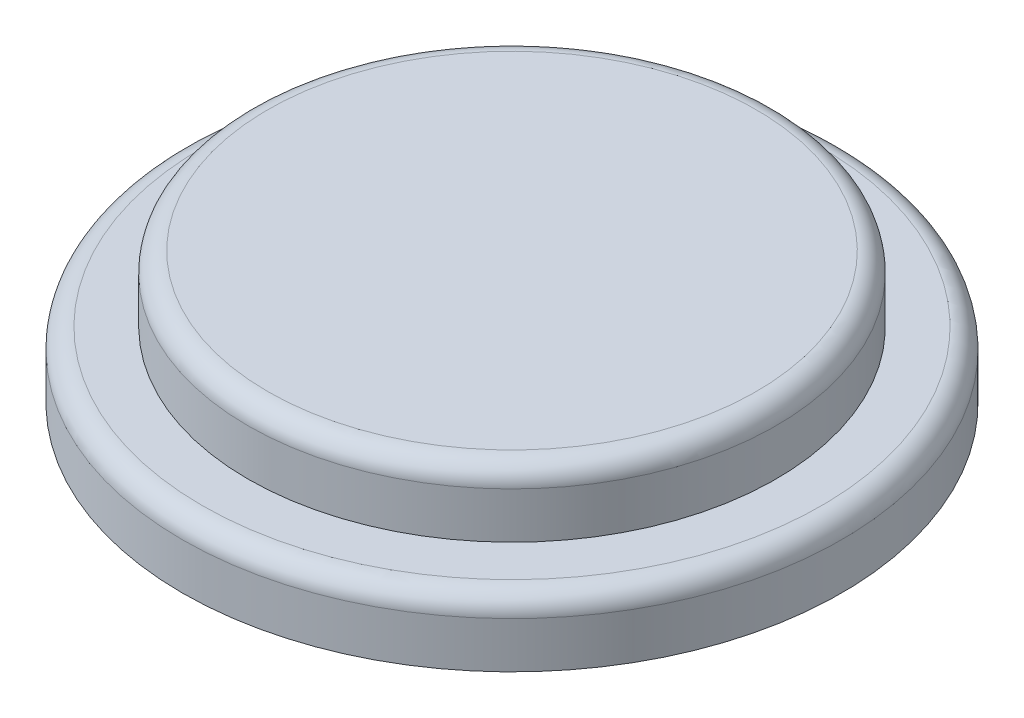
ISO-10303-21;
HEADER;
FILE_DESCRIPTION(('STEP AP214'),'2;1');
FILE_NAME('part.step','',(''),(''),'','','');
FILE_SCHEMA(('AUTOMOTIVE_DESIGN { 1 0 10303 214 1 1 1 1 }'));
ENDSEC;
DATA;
#1=APPLICATION_CONTEXT('core data for automotive mechanical design processes');
#2=APPLICATION_PROTOCOL_DEFINITION('international standard','automotive_design',2000,#1);
#3=PRODUCT_CONTEXT('',#1,'mechanical');
#4=PRODUCT('Part','Part','',(#3));
#5=PRODUCT_RELATED_PRODUCT_CATEGORY('part','',(#4));
#6=PRODUCT_DEFINITION_FORMATION('','',#4);
#7=PRODUCT_DEFINITION_CONTEXT('part definition',#1,'design');
#8=PRODUCT_DEFINITION('design','',#6,#7);
#9=PRODUCT_DEFINITION_SHAPE('','',#8);
#10=(LENGTH_UNIT() NAMED_UNIT(*) SI_UNIT(.MILLI.,.METRE.));
#11=(NAMED_UNIT(*) PLANE_ANGLE_UNIT() SI_UNIT($,.RADIAN.));
#12=(NAMED_UNIT(*) SI_UNIT($,.STERADIAN.) SOLID_ANGLE_UNIT());
#13=UNCERTAINTY_MEASURE_WITH_UNIT(LENGTH_MEASURE(1.E-05),#10,'distance_accuracy_value','');
#14=(GEOMETRIC_REPRESENTATION_CONTEXT(3) GLOBAL_UNCERTAINTY_ASSIGNED_CONTEXT((#13)) GLOBAL_UNIT_ASSIGNED_CONTEXT((#10,
#11,#12)) REPRESENTATION_CONTEXT('',''));
#15=CARTESIAN_POINT('',(0.,0.,0.));
#16=DIRECTION('',(0.,0.,1.));
#17=DIRECTION('',(1.,0.,0.));
#18=AXIS2_PLACEMENT_3D('',#15,#16,#17);
#19=CARTESIAN_POINT('',(0.,2.54,0.));
#20=DIRECTION('',(0.,-1.,0.));
#21=DIRECTION('',(0.,0.,-1.));
#22=AXIS2_PLACEMENT_3D('',#19,#20,#21);
#23=CYLINDRICAL_SURFACE('',#22,12.7);
#24=CARTESIAN_POINT('',(0.,1.778,0.));
#25=DIRECTION('',(0.,1.,0.));
#26=DIRECTION('',(0.,0.,1.));
#27=AXIS2_PLACEMENT_3D('',#24,#25,#26);
#28=CIRCLE('',#27,12.7);
#29=CARTESIAN_POINT('',(0.,1.778,12.7));
#30=VERTEX_POINT('',#29);
#31=EDGE_CURVE('E50',#30,#30,#28,.F.);
#32=ORIENTED_EDGE('',*,*,#31,.T.);
#33=EDGE_LOOP('',(#32));
#34=FACE_BOUND('',#33,.T.);
#35=CARTESIAN_POINT('',(0.,0.,0.));
#36=DIRECTION('',(0.,1.,0.));
#37=DIRECTION('',(0.,0.,1.));
#38=AXIS2_PLACEMENT_3D('',#35,#36,#37);
#39=CIRCLE('',#38,12.7);
#40=CARTESIAN_POINT('',(0.,0.,12.7));
#41=VERTEX_POINT('',#40);
#42=EDGE_CURVE('E62',#41,#41,#39,.T.);
#43=ORIENTED_EDGE('',*,*,#42,.T.);
#44=EDGE_LOOP('',(#43));
#45=FACE_BOUND('',#44,.T.);
#46=ADVANCED_FACE('F37',(#34,#45),#23,.T.);
#47=CARTESIAN_POINT('',(0.,2.54,0.));
#48=DIRECTION('',(0.,1.,0.));
#49=DIRECTION('',(0.,0.,1.));
#50=AXIS2_PLACEMENT_3D('',#47,#48,#49);
#51=PLANE('',#50);
#52=CARTESIAN_POINT('',(0.,2.54,0.));
#53=DIRECTION('',(0.,1.,0.));
#54=DIRECTION('',(0.,0.,1.));
#55=AXIS2_PLACEMENT_3D('',#52,#53,#54);
#56=CIRCLE('',#55,11.938);
#57=CARTESIAN_POINT('',(0.,2.54,11.938));
#58=VERTEX_POINT('',#57);
#59=EDGE_CURVE('E55',#58,#58,#56,.T.);
#60=ORIENTED_EDGE('',*,*,#59,.T.);
#61=EDGE_LOOP('',(#60));
#62=FACE_BOUND('',#61,.T.);
#63=CARTESIAN_POINT('',(0.,2.54,0.));
#64=DIRECTION('',(0.,1.,0.));
#65=DIRECTION('',(0.,0.,1.));
#66=AXIS2_PLACEMENT_3D('',#63,#64,#65);
#67=CIRCLE('',#66,10.1721842574618);
#68=CARTESIAN_POINT('',(0.,2.54,10.1721842574618));
#69=VERTEX_POINT('',#68);
#70=EDGE_CURVE('E61',#69,#69,#67,.T.);
#71=ORIENTED_EDGE('',*,*,#70,.F.);
#72=EDGE_LOOP('',(#71));
#73=FACE_BOUND('',#72,.T.);
#74=ADVANCED_FACE('F72',(#62,#73),#51,.T.);
#75=CARTESIAN_POINT('',(0.,0.,0.));
#76=DIRECTION('',(0.,1.,0.));
#77=DIRECTION('',(0.,0.,1.));
#78=AXIS2_PLACEMENT_3D('',#75,#76,#77);
#79=PLANE('',#78);
#80=ORIENTED_EDGE('',*,*,#42,.F.);
#81=EDGE_LOOP('',(#80));
#82=FACE_BOUND('',#81,.T.);
#83=ADVANCED_FACE('F74',(#82),#79,.F.);
#84=CARTESIAN_POINT('',(0.,5.08,0.));
#85=DIRECTION('',(0.,-1.,0.));
#86=DIRECTION('',(0.,0.,-1.));
#87=AXIS2_PLACEMENT_3D('',#84,#85,#86);
#88=CYLINDRICAL_SURFACE('',#87,10.1721842574618);
#89=CARTESIAN_POINT('',(0.,4.318,0.));
#90=DIRECTION('',(0.,1.,0.));
#91=DIRECTION('',(0.,0.,1.));
#92=AXIS2_PLACEMENT_3D('',#89,#90,#91);
#93=CIRCLE('',#92,10.1721842574618);
#94=CARTESIAN_POINT('',(0.,4.318,10.1721842574618));
#95=VERTEX_POINT('',#94);
#96=EDGE_CURVE('E10',#95,#95,#93,.F.);
#97=ORIENTED_EDGE('',*,*,#96,.T.);
#98=EDGE_LOOP('',(#97));
#99=FACE_BOUND('',#98,.T.);
#100=ORIENTED_EDGE('',*,*,#70,.T.);
#101=EDGE_LOOP('',(#100));
#102=FACE_BOUND('',#101,.T.);
#103=ADVANCED_FACE('F70',(#99,#102),#88,.T.);
#104=CARTESIAN_POINT('',(0.,5.08,0.));
#105=DIRECTION('',(0.,1.,0.));
#106=DIRECTION('',(0.,0.,1.));
#107=AXIS2_PLACEMENT_3D('',#104,#105,#106);
#108=PLANE('',#107);
#109=CARTESIAN_POINT('',(0.,5.08,0.));
#110=DIRECTION('',(0.,1.,0.));
#111=DIRECTION('',(0.,0.,1.));
#112=AXIS2_PLACEMENT_3D('',#109,#110,#111);
#113=CIRCLE('',#112,9.41018425746183);
#114=CARTESIAN_POINT('',(0.,5.08,9.41018425746183));
#115=VERTEX_POINT('',#114);
#116=EDGE_CURVE('E45',#115,#115,#113,.T.);
#117=ORIENTED_EDGE('',*,*,#116,.T.);
#118=EDGE_LOOP('',(#117));
#119=FACE_BOUND('',#118,.T.);
#120=ADVANCED_FACE('F89',(#119),#108,.T.);
#121=CARTESIAN_POINT('',(0.,1.778,0.));
#122=DIRECTION('',(0.,1.,0.));
#123=DIRECTION('',(0.,0.,1.));
#124=AXIS2_PLACEMENT_3D('',#121,#122,#123);
#125=TOROIDAL_SURFACE('',#124,11.938,0.762);
#126=ORIENTED_EDGE('',*,*,#31,.F.);
#127=EDGE_LOOP('',(#126));
#128=FACE_BOUND('',#127,.T.);
#129=ORIENTED_EDGE('',*,*,#59,.F.);
#130=EDGE_LOOP('',(#129));
#131=FACE_BOUND('',#130,.T.);
#132=ADVANCED_FACE('F87',(#128,#131),#125,.T.);
#133=CARTESIAN_POINT('',(0.,4.318,0.));
#134=DIRECTION('',(0.,1.,0.));
#135=DIRECTION('',(0.,0.,1.));
#136=AXIS2_PLACEMENT_3D('',#133,#134,#135);
#137=TOROIDAL_SURFACE('',#136,9.41018425746183,0.762);
#138=ORIENTED_EDGE('',*,*,#96,.F.);
#139=EDGE_LOOP('',(#138));
#140=FACE_BOUND('',#139,.T.);
#141=ORIENTED_EDGE('',*,*,#116,.F.);
#142=EDGE_LOOP('',(#141));
#143=FACE_BOUND('',#142,.T.);
#144=ADVANCED_FACE('F39',(#140,#143),#137,.T.);
#145=CLOSED_SHELL('',(#46,#74,#83,#103,#120,#132,#144));
#146=MANIFOLD_SOLID_BREP('B2',#145);
#147=ADVANCED_BREP_SHAPE_REPRESENTATION('',(#18,#146),#14);
#148=SHAPE_DEFINITION_REPRESENTATION(#9,#147);
ENDSEC;
END-ISO-10303-21;
